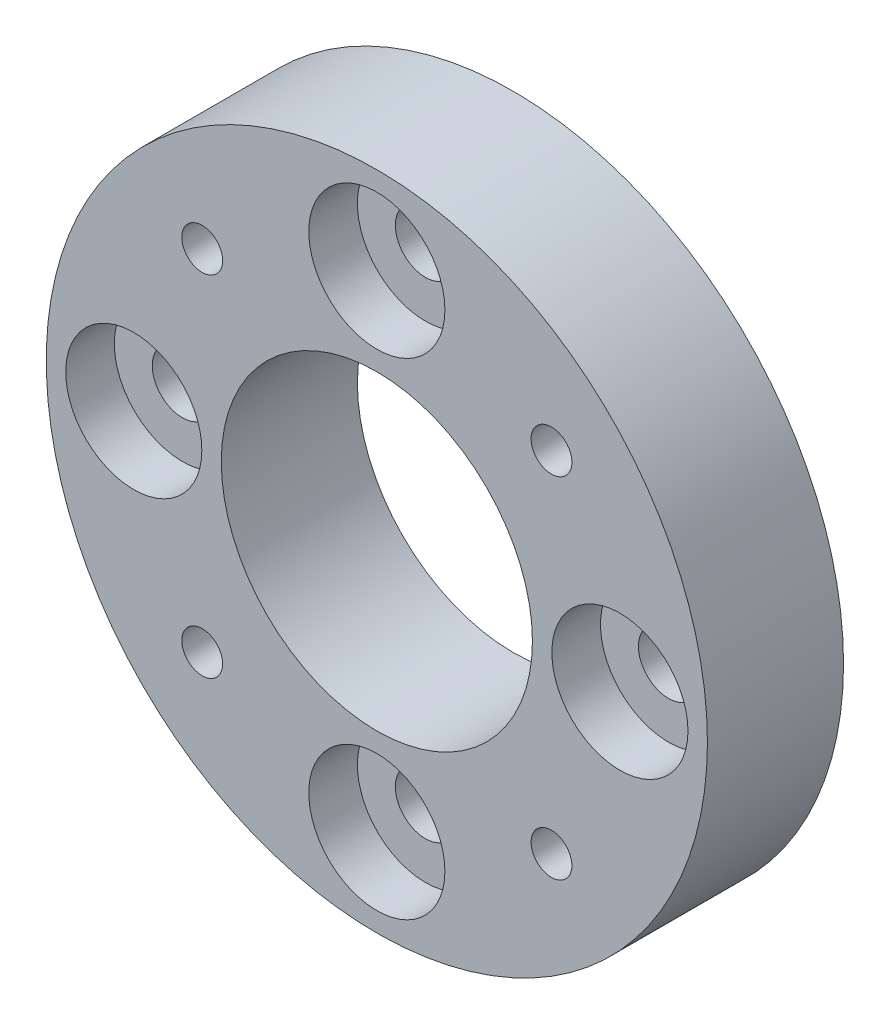
ISO-10303-21;
HEADER;
FILE_DESCRIPTION(('STEP AP214'),'2;1');
FILE_NAME('part.step','',(''),(''),'','','');
FILE_SCHEMA(('AUTOMOTIVE_DESIGN { 1 0 10303 214 1 1 1 1 }'));
ENDSEC;
DATA;
#1=APPLICATION_CONTEXT('core data for automotive mechanical design processes');
#2=APPLICATION_PROTOCOL_DEFINITION('international standard','automotive_design',2000,#1);
#3=PRODUCT_CONTEXT('',#1,'mechanical');
#4=PRODUCT('Part','Part','',(#3));
#5=PRODUCT_RELATED_PRODUCT_CATEGORY('part','',(#4));
#6=PRODUCT_DEFINITION_FORMATION('','',#4);
#7=PRODUCT_DEFINITION_CONTEXT('part definition',#1,'design');
#8=PRODUCT_DEFINITION('design','',#6,#7);
#9=PRODUCT_DEFINITION_SHAPE('','',#8);
#10=(LENGTH_UNIT() NAMED_UNIT(*) SI_UNIT(.MILLI.,.METRE.));
#11=(NAMED_UNIT(*) PLANE_ANGLE_UNIT() SI_UNIT($,.RADIAN.));
#12=(NAMED_UNIT(*) SI_UNIT($,.STERADIAN.) SOLID_ANGLE_UNIT());
#13=UNCERTAINTY_MEASURE_WITH_UNIT(LENGTH_MEASURE(1.E-05),#10,'distance_accuracy_value','');
#14=(GEOMETRIC_REPRESENTATION_CONTEXT(3) GLOBAL_UNCERTAINTY_ASSIGNED_CONTEXT((#13)) GLOBAL_UNIT_ASSIGNED_CONTEXT((#10,
#11,#12)) REPRESENTATION_CONTEXT('',''));
#15=CARTESIAN_POINT('',(0.,0.,0.));
#16=DIRECTION('',(0.,0.,1.));
#17=DIRECTION('',(1.,0.,0.));
#18=AXIS2_PLACEMENT_3D('',#15,#16,#17);
#19=CARTESIAN_POINT('',(0.,12.5,7.));
#20=DIRECTION('',(0.,0.,-1.));
#21=DIRECTION('',(-1.,0.,0.));
#22=AXIS2_PLACEMENT_3D('',#19,#20,#21);
#23=CYLINDRICAL_SURFACE('',#22,1.55);
#24=CARTESIAN_POINT('',(0.,12.5,0.));
#25=DIRECTION('',(0.,0.,1.));
#26=DIRECTION('',(1.,0.,0.));
#27=AXIS2_PLACEMENT_3D('',#24,#25,#26);
#28=CIRCLE('',#27,1.55);
#29=CARTESIAN_POINT('',(1.55,12.5,0.));
#30=VERTEX_POINT('',#29);
#31=EDGE_CURVE('E52',#30,#30,#28,.T.);
#32=ORIENTED_EDGE('',*,*,#31,.F.);
#33=EDGE_LOOP('',(#32));
#34=FACE_BOUND('',#33,.T.);
#35=CARTESIAN_POINT('',(0.,12.5,4.5));
#36=DIRECTION('',(0.,0.,1.));
#37=DIRECTION('',(1.,0.,0.));
#38=AXIS2_PLACEMENT_3D('',#35,#36,#37);
#39=CIRCLE('',#38,1.55);
#40=CARTESIAN_POINT('',(1.55,12.5,4.5));
#41=VERTEX_POINT('',#40);
#42=EDGE_CURVE('E41',#41,#41,#39,.T.);
#43=ORIENTED_EDGE('',*,*,#42,.T.);
#44=EDGE_LOOP('',(#43));
#45=FACE_BOUND('',#44,.T.);
#46=ADVANCED_FACE('F37',(#34,#45),#23,.F.);
#47=CARTESIAN_POINT('',(12.5000000000004,3.53740559381116E-13,7.));
#48=DIRECTION('',(0.,0.,-1.));
#49=DIRECTION('',(-1.,0.,0.));
#50=AXIS2_PLACEMENT_3D('',#47,#48,#49);
#51=CYLINDRICAL_SURFACE('',#50,1.55000000000028);
#52=CARTESIAN_POINT('',(12.5000000000004,3.53740559381116E-13,0.));
#53=DIRECTION('',(0.,0.,1.));
#54=DIRECTION('',(1.,0.,0.));
#55=AXIS2_PLACEMENT_3D('',#52,#53,#54);
#56=CIRCLE('',#55,1.55000000000028);
#57=CARTESIAN_POINT('',(14.0500000000006,3.53740559381116E-13,0.));
#58=VERTEX_POINT('',#57);
#59=EDGE_CURVE('E110',#58,#58,#56,.T.);
#60=ORIENTED_EDGE('',*,*,#59,.F.);
#61=EDGE_LOOP('',(#60));
#62=FACE_BOUND('',#61,.T.);
#63=CARTESIAN_POINT('',(12.5000000000004,3.53740559381116E-13,4.5));
#64=DIRECTION('',(0.,0.,1.));
#65=DIRECTION('',(1.,0.,0.));
#66=AXIS2_PLACEMENT_3D('',#63,#64,#65);
#67=CIRCLE('',#66,1.55000000000028);
#68=CARTESIAN_POINT('',(14.0500000000006,3.53740559381116E-13,4.5));
#69=VERTEX_POINT('',#68);
#70=EDGE_CURVE('E65',#69,#69,#67,.T.);
#71=ORIENTED_EDGE('',*,*,#70,.T.);
#72=EDGE_LOOP('',(#71));
#73=FACE_BOUND('',#72,.T.);
#74=ADVANCED_FACE('F148',(#62,#73),#51,.F.);
#75=CARTESIAN_POINT('',(7.07481118762232E-13,-12.5,7.));
#76=DIRECTION('',(0.,0.,-1.));
#77=DIRECTION('',(-1.,0.,0.));
#78=AXIS2_PLACEMENT_3D('',#75,#76,#77);
#79=CYLINDRICAL_SURFACE('',#78,1.55000000000076);
#80=CARTESIAN_POINT('',(7.07481118762232E-13,-12.5,0.));
#81=DIRECTION('',(0.,0.,1.));
#82=DIRECTION('',(1.,0.,0.));
#83=AXIS2_PLACEMENT_3D('',#80,#81,#82);
#84=CIRCLE('',#83,1.55000000000076);
#85=CARTESIAN_POINT('',(1.55000000000147,-12.5,0.));
#86=VERTEX_POINT('',#85);
#87=EDGE_CURVE('E106',#86,#86,#84,.T.);
#88=ORIENTED_EDGE('',*,*,#87,.F.);
#89=EDGE_LOOP('',(#88));
#90=FACE_BOUND('',#89,.T.);
#91=CARTESIAN_POINT('',(7.07481118762232E-13,-12.5,4.5));
#92=DIRECTION('',(0.,0.,1.));
#93=DIRECTION('',(1.,0.,0.));
#94=AXIS2_PLACEMENT_3D('',#91,#92,#93);
#95=CIRCLE('',#94,1.55000000000076);
#96=CARTESIAN_POINT('',(1.55000000000147,-12.5,4.5));
#97=VERTEX_POINT('',#96);
#98=EDGE_CURVE('E61',#97,#97,#95,.T.);
#99=ORIENTED_EDGE('',*,*,#98,.T.);
#100=EDGE_LOOP('',(#99));
#101=FACE_BOUND('',#100,.T.);
#102=ADVANCED_FACE('F153',(#90,#101),#79,.F.);
#103=CARTESIAN_POINT('',(-12.4999999999996,-3.5527136788005E-13,7.));
#104=DIRECTION('',(0.,0.,-1.));
#105=DIRECTION('',(-1.,0.,0.));
#106=AXIS2_PLACEMENT_3D('',#103,#104,#105);
#107=CYLINDRICAL_SURFACE('',#106,1.55000000000057);
#108=CARTESIAN_POINT('',(-12.4999999999996,-3.5527136788005E-13,0.));
#109=DIRECTION('',(0.,0.,1.));
#110=DIRECTION('',(1.,0.,0.));
#111=AXIS2_PLACEMENT_3D('',#108,#109,#110);
#112=CIRCLE('',#111,1.55000000000057);
#113=CARTESIAN_POINT('',(-10.9499999999991,-3.5527136788005E-13,0.));
#114=VERTEX_POINT('',#113);
#115=EDGE_CURVE('E99',#114,#114,#112,.T.);
#116=ORIENTED_EDGE('',*,*,#115,.F.);
#117=EDGE_LOOP('',(#116));
#118=FACE_BOUND('',#117,.T.);
#119=CARTESIAN_POINT('',(-12.4999999999996,-3.5527136788005E-13,4.5));
#120=DIRECTION('',(0.,0.,1.));
#121=DIRECTION('',(1.,0.,0.));
#122=AXIS2_PLACEMENT_3D('',#119,#120,#121);
#123=CIRCLE('',#122,1.55000000000057);
#124=CARTESIAN_POINT('',(-10.9499999999991,-3.5527136788005E-13,4.5));
#125=VERTEX_POINT('',#124);
#126=EDGE_CURVE('E57',#125,#125,#123,.T.);
#127=ORIENTED_EDGE('',*,*,#126,.T.);
#128=EDGE_LOOP('',(#127));
#129=FACE_BOUND('',#128,.T.);
#130=ADVANCED_FACE('F160',(#118,#129),#107,.F.);
#131=CARTESIAN_POINT('',(0.,0.,7.));
#132=DIRECTION('',(0.,0.,1.));
#133=DIRECTION('',(1.,0.,0.));
#134=AXIS2_PLACEMENT_3D('',#131,#132,#133);
#135=PLANE('',#134);
#136=CARTESIAN_POINT('',(0.,12.5,7.));
#137=DIRECTION('',(0.,0.,1.));
#138=DIRECTION('',(1.,0.,0.));
#139=AXIS2_PLACEMENT_3D('',#136,#137,#138);
#140=CIRCLE('',#139,3.5);
#141=CARTESIAN_POINT('',(3.5,12.5,7.));
#142=VERTEX_POINT('',#141);
#143=EDGE_CURVE('E336',#142,#142,#140,.T.);
#144=ORIENTED_EDGE('',*,*,#143,.F.);
#145=EDGE_LOOP('',(#144));
#146=FACE_BOUND('',#145,.T.);
#147=CARTESIAN_POINT('',(12.5000000000004,3.53740559381116E-13,7.));
#148=DIRECTION('',(0.,0.,1.));
#149=DIRECTION('',(1.,0.,0.));
#150=AXIS2_PLACEMENT_3D('',#147,#148,#149);
#151=CIRCLE('',#150,3.5);
#152=CARTESIAN_POINT('',(16.0000000000004,3.53740559381116E-13,7.));
#153=VERTEX_POINT('',#152);
#154=EDGE_CURVE('E346',#153,#153,#151,.T.);
#155=ORIENTED_EDGE('',*,*,#154,.F.);
#156=EDGE_LOOP('',(#155));
#157=FACE_BOUND('',#156,.T.);
#158=CARTESIAN_POINT('',(7.07481118762232E-13,-12.5,7.));
#159=DIRECTION('',(0.,0.,1.));
#160=DIRECTION('',(1.,0.,0.));
#161=AXIS2_PLACEMENT_3D('',#158,#159,#160);
#162=CIRCLE('',#161,3.5);
#163=CARTESIAN_POINT('',(3.50000000000071,-12.5,7.));
#164=VERTEX_POINT('',#163);
#165=EDGE_CURVE('E354',#164,#164,#162,.T.);
#166=ORIENTED_EDGE('',*,*,#165,.F.);
#167=EDGE_LOOP('',(#166));
#168=FACE_BOUND('',#167,.T.);
#169=CARTESIAN_POINT('',(-12.4999999999996,-3.5527136788005E-13,7.));
#170=DIRECTION('',(0.,0.,1.));
#171=DIRECTION('',(1.,0.,0.));
#172=AXIS2_PLACEMENT_3D('',#169,#170,#171);
#173=CIRCLE('',#172,3.5);
#174=CARTESIAN_POINT('',(-8.99999999999965,-3.5527136788005E-13,7.));
#175=VERTEX_POINT('',#174);
#176=EDGE_CURVE('E361',#175,#175,#173,.T.);
#177=ORIENTED_EDGE('',*,*,#176,.F.);
#178=EDGE_LOOP('',(#177));
#179=FACE_BOUND('',#178,.T.);
#180=CARTESIAN_POINT('',(8.98025612106971,-8.9802561210686,7.));
#181=DIRECTION('',(0.,0.,1.));
#182=DIRECTION('',(1.,0.,0.));
#183=AXIS2_PLACEMENT_3D('',#180,#181,#182);
#184=CIRCLE('',#183,1.05000000000071);
#185=CARTESIAN_POINT('',(10.0302561210704,-8.9802561210686,7.));
#186=VERTEX_POINT('',#185);
#187=EDGE_CURVE('E87',#186,#186,#184,.T.);
#188=ORIENTED_EDGE('',*,*,#187,.F.);
#189=EDGE_LOOP('',(#188));
#190=FACE_BOUND('',#189,.T.);
#191=CARTESIAN_POINT('',(-8.9802561210692,8.98025612106911,7.));
#192=DIRECTION('',(0.,0.,1.));
#193=DIRECTION('',(1.,0.,0.));
#194=AXIS2_PLACEMENT_3D('',#191,#192,#193);
#195=CIRCLE('',#194,1.05);
#196=CARTESIAN_POINT('',(-7.9302561210692,8.98025612106911,7.));
#197=VERTEX_POINT('',#196);
#198=EDGE_CURVE('E123',#197,#197,#195,.T.);
#199=ORIENTED_EDGE('',*,*,#198,.F.);
#200=EDGE_LOOP('',(#199));
#201=FACE_BOUND('',#200,.T.);
#202=CARTESIAN_POINT('',(0.,0.,7.));
#203=DIRECTION('',(0.,0.,1.));
#204=DIRECTION('',(1.,0.,0.));
#205=AXIS2_PLACEMENT_3D('',#202,#203,#204);
#206=CIRCLE('',#205,17.);
#207=CARTESIAN_POINT('',(17.,0.,7.));
#208=VERTEX_POINT('',#207);
#209=EDGE_CURVE('E10',#208,#208,#206,.T.);
#210=ORIENTED_EDGE('',*,*,#209,.T.);
#211=EDGE_LOOP('',(#210));
#212=FACE_BOUND('',#211,.T.);
#213=CARTESIAN_POINT('',(0.,0.,7.));
#214=DIRECTION('',(0.,0.,1.));
#215=DIRECTION('',(1.,0.,0.));
#216=AXIS2_PLACEMENT_3D('',#213,#214,#215);
#217=CIRCLE('',#216,8.);
#218=CARTESIAN_POINT('',(8.,0.,7.));
#219=VERTEX_POINT('',#218);
#220=EDGE_CURVE('E115',#219,#219,#217,.T.);
#221=ORIENTED_EDGE('',*,*,#220,.F.);
#222=EDGE_LOOP('',(#221));
#223=FACE_BOUND('',#222,.T.);
#224=CARTESIAN_POINT('',(8.98025612106911,8.98025612106971,7.));
#225=DIRECTION('',(0.,0.,1.));
#226=DIRECTION('',(1.,0.,0.));
#227=AXIS2_PLACEMENT_3D('',#224,#225,#226);
#228=CIRCLE('',#227,1.05000000000052);
#229=CARTESIAN_POINT('',(10.0302561210696,8.98025612106971,7.));
#230=VERTEX_POINT('',#229);
#231=EDGE_CURVE('E95',#230,#230,#228,.T.);
#232=ORIENTED_EDGE('',*,*,#231,.F.);
#233=EDGE_LOOP('',(#232));
#234=FACE_BOUND('',#233,.T.);
#235=CARTESIAN_POINT('',(-8.9802561210686,-8.9802561210692,7.));
#236=DIRECTION('',(0.,0.,1.));
#237=DIRECTION('',(1.,0.,0.));
#238=AXIS2_PLACEMENT_3D('',#235,#236,#237);
#239=CIRCLE('',#238,1.05000000000027);
#240=CARTESIAN_POINT('',(-7.93025612106833,-8.9802561210692,7.));
#241=VERTEX_POINT('',#240);
#242=EDGE_CURVE('E77',#241,#241,#239,.T.);
#243=ORIENTED_EDGE('',*,*,#242,.F.);
#244=EDGE_LOOP('',(#243));
#245=FACE_BOUND('',#244,.T.);
#246=ADVANCED_FACE('F158',(#146,#157,#168,#179,#190,#201,#212,#223,#234,#245),#135,.T.);
#247=CARTESIAN_POINT('',(0.,0.,0.));
#248=DIRECTION('',(0.,0.,1.));
#249=DIRECTION('',(1.,0.,0.));
#250=AXIS2_PLACEMENT_3D('',#247,#248,#249);
#251=PLANE('',#250);
#252=CARTESIAN_POINT('',(0.,0.,0.));
#253=DIRECTION('',(0.,0.,1.));
#254=DIRECTION('',(1.,0.,0.));
#255=AXIS2_PLACEMENT_3D('',#252,#253,#254);
#256=CIRCLE('',#255,17.);
#257=CARTESIAN_POINT('',(17.,0.,0.));
#258=VERTEX_POINT('',#257);
#259=EDGE_CURVE('E46',#258,#258,#256,.T.);
#260=ORIENTED_EDGE('',*,*,#259,.F.);
#261=EDGE_LOOP('',(#260));
#262=FACE_BOUND('',#261,.T.);
#263=ORIENTED_EDGE('',*,*,#31,.T.);
#264=EDGE_LOOP('',(#263));
#265=FACE_BOUND('',#264,.T.);
#266=CARTESIAN_POINT('',(-8.9802561210692,8.98025612106911,0.));
#267=DIRECTION('',(0.,0.,1.));
#268=DIRECTION('',(1.,0.,0.));
#269=AXIS2_PLACEMENT_3D('',#266,#267,#268);
#270=CIRCLE('',#269,1.05);
#271=CARTESIAN_POINT('',(-7.9302561210692,8.98025612106911,0.));
#272=VERTEX_POINT('',#271);
#273=EDGE_CURVE('E119',#272,#272,#270,.T.);
#274=ORIENTED_EDGE('',*,*,#273,.T.);
#275=EDGE_LOOP('',(#274));
#276=FACE_BOUND('',#275,.T.);
#277=CARTESIAN_POINT('',(0.,0.,0.));
#278=DIRECTION('',(0.,0.,1.));
#279=DIRECTION('',(1.,0.,0.));
#280=AXIS2_PLACEMENT_3D('',#277,#278,#279);
#281=CIRCLE('',#280,8.);
#282=CARTESIAN_POINT('',(8.,0.,0.));
#283=VERTEX_POINT('',#282);
#284=EDGE_CURVE('E114',#283,#283,#281,.T.);
#285=ORIENTED_EDGE('',*,*,#284,.T.);
#286=EDGE_LOOP('',(#285));
#287=FACE_BOUND('',#286,.T.);
#288=ORIENTED_EDGE('',*,*,#59,.T.);
#289=EDGE_LOOP('',(#288));
#290=FACE_BOUND('',#289,.T.);
#291=ORIENTED_EDGE('',*,*,#87,.T.);
#292=EDGE_LOOP('',(#291));
#293=FACE_BOUND('',#292,.T.);
#294=ORIENTED_EDGE('',*,*,#115,.T.);
#295=EDGE_LOOP('',(#294));
#296=FACE_BOUND('',#295,.T.);
#297=CARTESIAN_POINT('',(8.98025612106911,8.98025612106971,0.));
#298=DIRECTION('',(0.,0.,1.));
#299=DIRECTION('',(1.,0.,0.));
#300=AXIS2_PLACEMENT_3D('',#297,#298,#299);
#301=CIRCLE('',#300,1.05000000000052);
#302=CARTESIAN_POINT('',(10.0302561210696,8.98025612106971,0.));
#303=VERTEX_POINT('',#302);
#304=EDGE_CURVE('E91',#303,#303,#301,.T.);
#305=ORIENTED_EDGE('',*,*,#304,.T.);
#306=EDGE_LOOP('',(#305));
#307=FACE_BOUND('',#306,.T.);
#308=CARTESIAN_POINT('',(8.98025612106971,-8.9802561210686,0.));
#309=DIRECTION('',(0.,0.,1.));
#310=DIRECTION('',(1.,0.,0.));
#311=AXIS2_PLACEMENT_3D('',#308,#309,#310);
#312=CIRCLE('',#311,1.05000000000071);
#313=CARTESIAN_POINT('',(10.0302561210704,-8.9802561210686,0.));
#314=VERTEX_POINT('',#313);
#315=EDGE_CURVE('E83',#314,#314,#312,.T.);
#316=ORIENTED_EDGE('',*,*,#315,.T.);
#317=EDGE_LOOP('',(#316));
#318=FACE_BOUND('',#317,.T.);
#319=CARTESIAN_POINT('',(-8.9802561210686,-8.9802561210692,0.));
#320=DIRECTION('',(0.,0.,1.));
#321=DIRECTION('',(1.,0.,0.));
#322=AXIS2_PLACEMENT_3D('',#319,#320,#321);
#323=CIRCLE('',#322,1.05000000000027);
#324=CARTESIAN_POINT('',(-7.93025612106833,-8.9802561210692,0.));
#325=VERTEX_POINT('',#324);
#326=EDGE_CURVE('E72',#325,#325,#323,.T.);
#327=ORIENTED_EDGE('',*,*,#326,.T.);
#328=EDGE_LOOP('',(#327));
#329=FACE_BOUND('',#328,.T.);
#330=ADVANCED_FACE('F130',(#262,#265,#276,#287,#290,#293,#296,#307,#318,#329),#251,.F.);
#331=CARTESIAN_POINT('',(0.,0.,7.));
#332=DIRECTION('',(0.,0.,-1.));
#333=DIRECTION('',(-1.,0.,0.));
#334=AXIS2_PLACEMENT_3D('',#331,#332,#333);
#335=CYLINDRICAL_SURFACE('',#334,17.);
#336=ORIENTED_EDGE('',*,*,#209,.F.);
#337=EDGE_LOOP('',(#336));
#338=FACE_BOUND('',#337,.T.);
#339=ORIENTED_EDGE('',*,*,#259,.T.);
#340=EDGE_LOOP('',(#339));
#341=FACE_BOUND('',#340,.T.);
#342=ADVANCED_FACE('F39',(#338,#341),#335,.T.);
#343=CARTESIAN_POINT('',(-8.9802561210692,8.98025612106911,7.));
#344=DIRECTION('',(0.,0.,-1.));
#345=DIRECTION('',(-1.,0.,0.));
#346=AXIS2_PLACEMENT_3D('',#343,#344,#345);
#347=CYLINDRICAL_SURFACE('',#346,1.05);
#348=ORIENTED_EDGE('',*,*,#198,.T.);
#349=EDGE_LOOP('',(#348));
#350=FACE_BOUND('',#349,.T.);
#351=ORIENTED_EDGE('',*,*,#273,.F.);
#352=EDGE_LOOP('',(#351));
#353=FACE_BOUND('',#352,.T.);
#354=ADVANCED_FACE('F133',(#350,#353),#347,.F.);
#355=CARTESIAN_POINT('',(0.,0.,7.));
#356=DIRECTION('',(0.,0.,-1.));
#357=DIRECTION('',(-1.,0.,0.));
#358=AXIS2_PLACEMENT_3D('',#355,#356,#357);
#359=CYLINDRICAL_SURFACE('',#358,8.);
#360=ORIENTED_EDGE('',*,*,#220,.T.);
#361=EDGE_LOOP('',(#360));
#362=FACE_BOUND('',#361,.T.);
#363=ORIENTED_EDGE('',*,*,#284,.F.);
#364=EDGE_LOOP('',(#363));
#365=FACE_BOUND('',#364,.T.);
#366=ADVANCED_FACE('F135',(#362,#365),#359,.F.);
#367=CARTESIAN_POINT('',(8.98025612106911,8.98025612106971,7.));
#368=DIRECTION('',(0.,0.,-1.));
#369=DIRECTION('',(-1.,0.,0.));
#370=AXIS2_PLACEMENT_3D('',#367,#368,#369);
#371=CYLINDRICAL_SURFACE('',#370,1.05000000000052);
#372=ORIENTED_EDGE('',*,*,#231,.T.);
#373=EDGE_LOOP('',(#372));
#374=FACE_BOUND('',#373,.T.);
#375=ORIENTED_EDGE('',*,*,#304,.F.);
#376=EDGE_LOOP('',(#375));
#377=FACE_BOUND('',#376,.T.);
#378=ADVANCED_FACE('F142',(#374,#377),#371,.F.);
#379=CARTESIAN_POINT('',(8.98025612106971,-8.9802561210686,7.));
#380=DIRECTION('',(0.,0.,-1.));
#381=DIRECTION('',(-1.,0.,0.));
#382=AXIS2_PLACEMENT_3D('',#379,#380,#381);
#383=CYLINDRICAL_SURFACE('',#382,1.05000000000071);
#384=ORIENTED_EDGE('',*,*,#187,.T.);
#385=EDGE_LOOP('',(#384));
#386=FACE_BOUND('',#385,.T.);
#387=ORIENTED_EDGE('',*,*,#315,.F.);
#388=EDGE_LOOP('',(#387));
#389=FACE_BOUND('',#388,.T.);
#390=ADVANCED_FACE('F197',(#386,#389),#383,.F.);
#391=CARTESIAN_POINT('',(-8.9802561210686,-8.9802561210692,7.));
#392=DIRECTION('',(0.,0.,-1.));
#393=DIRECTION('',(-1.,0.,0.));
#394=AXIS2_PLACEMENT_3D('',#391,#392,#393);
#395=CYLINDRICAL_SURFACE('',#394,1.05000000000027);
#396=ORIENTED_EDGE('',*,*,#242,.T.);
#397=EDGE_LOOP('',(#396));
#398=FACE_BOUND('',#397,.T.);
#399=ORIENTED_EDGE('',*,*,#326,.F.);
#400=EDGE_LOOP('',(#399));
#401=FACE_BOUND('',#400,.T.);
#402=ADVANCED_FACE('F207',(#398,#401),#395,.F.);
#403=CARTESIAN_POINT('',(-12.4999999999996,-3.5527136788005E-13,4.5));
#404=DIRECTION('',(0.,0.,1.));
#405=DIRECTION('',(1.,0.,0.));
#406=AXIS2_PLACEMENT_3D('',#403,#404,#405);
#407=CYLINDRICAL_SURFACE('',#406,3.5);
#408=CARTESIAN_POINT('',(-12.4999999999996,-3.5527136788005E-13,4.5));
#409=DIRECTION('',(0.,0.,1.));
#410=DIRECTION('',(1.,0.,0.));
#411=AXIS2_PLACEMENT_3D('',#408,#409,#410);
#412=CIRCLE('',#411,3.5);
#413=CARTESIAN_POINT('',(-8.99999999999965,-3.5527136788005E-13,4.5));
#414=VERTEX_POINT('',#413);
#415=EDGE_CURVE('E358',#414,#414,#412,.T.);
#416=ORIENTED_EDGE('',*,*,#415,.F.);
#417=EDGE_LOOP('',(#416));
#418=FACE_BOUND('',#417,.T.);
#419=ORIENTED_EDGE('',*,*,#176,.T.);
#420=EDGE_LOOP('',(#419));
#421=FACE_BOUND('',#420,.T.);
#422=ADVANCED_FACE('F216',(#418,#421),#407,.F.);
#423=CARTESIAN_POINT('',(-12.4999999999996,-3.5527136788005E-13,4.5));
#424=DIRECTION('',(0.,0.,1.));
#425=DIRECTION('',(1.,0.,0.));
#426=AXIS2_PLACEMENT_3D('',#423,#424,#425);
#427=PLANE('',#426);
#428=ORIENTED_EDGE('',*,*,#126,.F.);
#429=EDGE_LOOP('',(#428));
#430=FACE_BOUND('',#429,.T.);
#431=ORIENTED_EDGE('',*,*,#415,.T.);
#432=EDGE_LOOP('',(#431));
#433=FACE_BOUND('',#432,.T.);
#434=ADVANCED_FACE('F258',(#430,#433),#427,.T.);
#435=CARTESIAN_POINT('',(7.07481118762232E-13,-12.5,4.5));
#436=DIRECTION('',(0.,0.,1.));
#437=DIRECTION('',(1.,0.,0.));
#438=AXIS2_PLACEMENT_3D('',#435,#436,#437);
#439=CYLINDRICAL_SURFACE('',#438,3.5);
#440=CARTESIAN_POINT('',(7.07481118762232E-13,-12.5,4.5));
#441=DIRECTION('',(0.,0.,1.));
#442=DIRECTION('',(1.,0.,0.));
#443=AXIS2_PLACEMENT_3D('',#440,#441,#442);
#444=CIRCLE('',#443,3.5);
#445=CARTESIAN_POINT('',(3.50000000000071,-12.5,4.5));
#446=VERTEX_POINT('',#445);
#447=EDGE_CURVE('E350',#446,#446,#444,.T.);
#448=ORIENTED_EDGE('',*,*,#447,.F.);
#449=EDGE_LOOP('',(#448));
#450=FACE_BOUND('',#449,.T.);
#451=ORIENTED_EDGE('',*,*,#165,.T.);
#452=EDGE_LOOP('',(#451));
#453=FACE_BOUND('',#452,.T.);
#454=ADVANCED_FACE('F268',(#450,#453),#439,.F.);
#455=CARTESIAN_POINT('',(7.07481118762232E-13,-12.5,4.5));
#456=DIRECTION('',(0.,0.,1.));
#457=DIRECTION('',(1.,0.,0.));
#458=AXIS2_PLACEMENT_3D('',#455,#456,#457);
#459=PLANE('',#458);
#460=ORIENTED_EDGE('',*,*,#98,.F.);
#461=EDGE_LOOP('',(#460));
#462=FACE_BOUND('',#461,.T.);
#463=ORIENTED_EDGE('',*,*,#447,.T.);
#464=EDGE_LOOP('',(#463));
#465=FACE_BOUND('',#464,.T.);
#466=ADVANCED_FACE('F278',(#462,#465),#459,.T.);
#467=CARTESIAN_POINT('',(12.5000000000004,3.53740559381116E-13,4.5));
#468=DIRECTION('',(0.,0.,1.));
#469=DIRECTION('',(1.,0.,0.));
#470=AXIS2_PLACEMENT_3D('',#467,#468,#469);
#471=CYLINDRICAL_SURFACE('',#470,3.5);
#472=CARTESIAN_POINT('',(12.5000000000004,3.53740559381116E-13,4.5));
#473=DIRECTION('',(0.,0.,1.));
#474=DIRECTION('',(1.,0.,0.));
#475=AXIS2_PLACEMENT_3D('',#472,#473,#474);
#476=CIRCLE('',#475,3.5);
#477=CARTESIAN_POINT('',(16.0000000000004,3.53740559381116E-13,4.5));
#478=VERTEX_POINT('',#477);
#479=EDGE_CURVE('E340',#478,#478,#476,.T.);
#480=ORIENTED_EDGE('',*,*,#479,.F.);
#481=EDGE_LOOP('',(#480));
#482=FACE_BOUND('',#481,.T.);
#483=ORIENTED_EDGE('',*,*,#154,.T.);
#484=EDGE_LOOP('',(#483));
#485=FACE_BOUND('',#484,.T.);
#486=ADVANCED_FACE('F288',(#482,#485),#471,.F.);
#487=CARTESIAN_POINT('',(12.5000000000004,3.53740559381116E-13,4.5));
#488=DIRECTION('',(0.,0.,1.));
#489=DIRECTION('',(1.,0.,0.));
#490=AXIS2_PLACEMENT_3D('',#487,#488,#489);
#491=PLANE('',#490);
#492=ORIENTED_EDGE('',*,*,#70,.F.);
#493=EDGE_LOOP('',(#492));
#494=FACE_BOUND('',#493,.T.);
#495=ORIENTED_EDGE('',*,*,#479,.T.);
#496=EDGE_LOOP('',(#495));
#497=FACE_BOUND('',#496,.T.);
#498=ADVANCED_FACE('F298',(#494,#497),#491,.T.);
#499=CARTESIAN_POINT('',(0.,12.5,4.5));
#500=DIRECTION('',(0.,0.,1.));
#501=DIRECTION('',(1.,0.,0.));
#502=AXIS2_PLACEMENT_3D('',#499,#500,#501);
#503=CYLINDRICAL_SURFACE('',#502,3.5);
#504=CARTESIAN_POINT('',(0.,12.5,4.5));
#505=DIRECTION('',(0.,0.,1.));
#506=DIRECTION('',(1.,0.,0.));
#507=AXIS2_PLACEMENT_3D('',#504,#505,#506);
#508=CIRCLE('',#507,3.5);
#509=CARTESIAN_POINT('',(3.5,12.5,4.5));
#510=VERTEX_POINT('',#509);
#511=EDGE_CURVE('E62',#510,#510,#508,.T.);
#512=ORIENTED_EDGE('',*,*,#511,.F.);
#513=EDGE_LOOP('',(#512));
#514=FACE_BOUND('',#513,.T.);
#515=ORIENTED_EDGE('',*,*,#143,.T.);
#516=EDGE_LOOP('',(#515));
#517=FACE_BOUND('',#516,.T.);
#518=ADVANCED_FACE('F308',(#514,#517),#503,.F.);
#519=CARTESIAN_POINT('',(0.,12.5,4.5));
#520=DIRECTION('',(0.,0.,1.));
#521=DIRECTION('',(1.,0.,0.));
#522=AXIS2_PLACEMENT_3D('',#519,#520,#521);
#523=PLANE('',#522);
#524=ORIENTED_EDGE('',*,*,#42,.F.);
#525=EDGE_LOOP('',(#524));
#526=FACE_BOUND('',#525,.T.);
#527=ORIENTED_EDGE('',*,*,#511,.T.);
#528=EDGE_LOOP('',(#527));
#529=FACE_BOUND('',#528,.T.);
#530=ADVANCED_FACE('F318',(#526,#529),#523,.T.);
#531=CLOSED_SHELL('',(#46,#74,#102,#130,#246,#330,#342,#354,#366,#378,#390,#402,#422,#434,#454,
#466,#486,#498,#518,#530));
#532=MANIFOLD_SOLID_BREP('B2',#531);
#533=ADVANCED_BREP_SHAPE_REPRESENTATION('',(#18,#532),#14);
#534=SHAPE_DEFINITION_REPRESENTATION(#9,#533);
ENDSEC;
END-ISO-10303-21;
